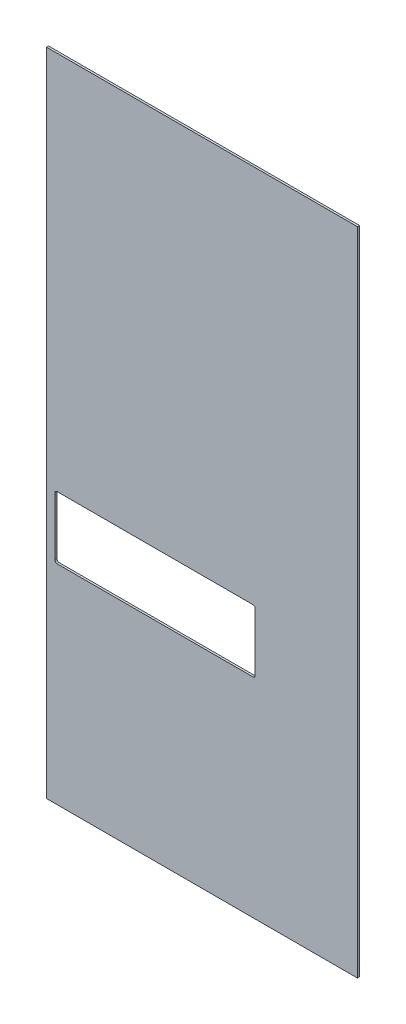
ISO-10303-21;
HEADER;
FILE_DESCRIPTION(('STEP AP214'),'2;1');
FILE_NAME('part.step','',(''),(''),'','','');
FILE_SCHEMA(('AUTOMOTIVE_DESIGN { 1 0 10303 214 1 1 1 1 }'));
ENDSEC;
DATA;
#1=APPLICATION_CONTEXT('core data for automotive mechanical design processes');
#2=APPLICATION_PROTOCOL_DEFINITION('international standard','automotive_design',2000,#1);
#3=PRODUCT_CONTEXT('',#1,'mechanical');
#4=PRODUCT('Part','Part','',(#3));
#5=PRODUCT_RELATED_PRODUCT_CATEGORY('part','',(#4));
#6=PRODUCT_DEFINITION_FORMATION('','',#4);
#7=PRODUCT_DEFINITION_CONTEXT('part definition',#1,'design');
#8=PRODUCT_DEFINITION('design','',#6,#7);
#9=PRODUCT_DEFINITION_SHAPE('','',#8);
#10=(LENGTH_UNIT() NAMED_UNIT(*) SI_UNIT(.MILLI.,.METRE.));
#11=(NAMED_UNIT(*) PLANE_ANGLE_UNIT() SI_UNIT($,.RADIAN.));
#12=(NAMED_UNIT(*) SI_UNIT($,.STERADIAN.) SOLID_ANGLE_UNIT());
#13=UNCERTAINTY_MEASURE_WITH_UNIT(LENGTH_MEASURE(1.E-05),#10,'distance_accuracy_value','');
#14=(GEOMETRIC_REPRESENTATION_CONTEXT(3) GLOBAL_UNCERTAINTY_ASSIGNED_CONTEXT((#13)) GLOBAL_UNIT_ASSIGNED_CONTEXT((#10,
#11,#12)) REPRESENTATION_CONTEXT('',''));
#15=CARTESIAN_POINT('',(0.,0.,0.));
#16=DIRECTION('',(0.,0.,1.));
#17=DIRECTION('',(1.,0.,0.));
#18=AXIS2_PLACEMENT_3D('',#15,#16,#17);
#19=CARTESIAN_POINT('',(0.,0.,0.));
#20=DIRECTION('',(0.,0.,1.));
#21=DIRECTION('',(1.,0.,0.));
#22=AXIS2_PLACEMENT_3D('',#19,#20,#21);
#23=PLANE('',#22);
#24=CARTESIAN_POINT('',(155.575,-349.25,0.));
#25=DIRECTION('',(0.,0.,-1.));
#26=DIRECTION('',(-1.,0.,0.));
#27=AXIS2_PLACEMENT_3D('',#24,#25,#26);
#28=CIRCLE('',#27,6.35);
#29=CARTESIAN_POINT('',(155.575,-355.6,0.));
#30=VERTEX_POINT('',#29);
#31=CARTESIAN_POINT('',(161.925,-349.25,0.));
#32=VERTEX_POINT('',#31);
#33=EDGE_CURVE('E176',#30,#32,#28,.F.);
#34=ORIENTED_EDGE('',*,*,#33,.T.);
#35=DIRECTION('',(0.,1.,0.));
#36=VECTOR('',#35,1.);
#37=CARTESIAN_POINT('',(161.925,-355.6,0.));
#38=LINE('',#37,#36);
#39=CARTESIAN_POINT('',(161.925,-171.45,0.));
#40=VERTEX_POINT('',#39);
#41=EDGE_CURVE('E154',#32,#40,#38,.T.);
#42=ORIENTED_EDGE('',*,*,#41,.T.);
#43=CARTESIAN_POINT('',(155.575,-171.45,0.));
#44=DIRECTION('',(0.,0.,-1.));
#45=DIRECTION('',(-1.,0.,0.));
#46=AXIS2_PLACEMENT_3D('',#43,#44,#45);
#47=CIRCLE('',#46,6.35);
#48=CARTESIAN_POINT('',(155.575,-165.1,0.));
#49=VERTEX_POINT('',#48);
#50=EDGE_CURVE('E177',#40,#49,#47,.F.);
#51=ORIENTED_EDGE('',*,*,#50,.T.);
#52=DIRECTION('',(1.,0.,0.));
#53=VECTOR('',#52,1.);
#54=CARTESIAN_POINT('',(161.925,-165.1,0.));
#55=LINE('',#54,#53);
#56=CARTESIAN_POINT('',(-441.325,-165.1,0.));
#57=VERTEX_POINT('',#56);
#58=EDGE_CURVE('E101',#49,#57,#55,.F.);
#59=ORIENTED_EDGE('',*,*,#58,.T.);
#60=CARTESIAN_POINT('',(-441.325,-171.45,0.));
#61=DIRECTION('',(0.,0.,-1.));
#62=DIRECTION('',(-1.,0.,0.));
#63=AXIS2_PLACEMENT_3D('',#60,#61,#62);
#64=CIRCLE('',#63,6.35);
#65=CARTESIAN_POINT('',(-447.675,-171.45,0.));
#66=VERTEX_POINT('',#65);
#67=EDGE_CURVE('E36',#57,#66,#64,.F.);
#68=ORIENTED_EDGE('',*,*,#67,.T.);
#69=DIRECTION('',(0.,1.,0.));
#70=VECTOR('',#69,1.);
#71=CARTESIAN_POINT('',(-447.675,-165.1,0.));
#72=LINE('',#71,#70);
#73=CARTESIAN_POINT('',(-447.675,-349.25,0.));
#74=VERTEX_POINT('',#73);
#75=EDGE_CURVE('E151',#66,#74,#72,.F.);
#76=ORIENTED_EDGE('',*,*,#75,.T.);
#77=CARTESIAN_POINT('',(-441.325,-349.25,0.));
#78=DIRECTION('',(0.,0.,-1.));
#79=DIRECTION('',(-1.,0.,0.));
#80=AXIS2_PLACEMENT_3D('',#77,#78,#79);
#81=CIRCLE('',#80,6.35);
#82=CARTESIAN_POINT('',(-441.325,-355.6,0.));
#83=VERTEX_POINT('',#82);
#84=EDGE_CURVE('E173',#74,#83,#81,.F.);
#85=ORIENTED_EDGE('',*,*,#84,.T.);
#86=DIRECTION('',(1.,0.,0.));
#87=VECTOR('',#86,1.);
#88=CARTESIAN_POINT('',(-447.675,-355.6,0.));
#89=LINE('',#88,#87);
#90=EDGE_CURVE('E147',#83,#30,#89,.T.);
#91=ORIENTED_EDGE('',*,*,#90,.T.);
#92=EDGE_LOOP('',(#34,#42,#51,#59,#68,#76,#85,#91));
#93=FACE_BOUND('',#92,.T.);
#94=DIRECTION('',(1.,0.,0.));
#95=VECTOR('',#94,1.);
#96=CARTESIAN_POINT('',(473.075,990.6,0.));
#97=LINE('',#96,#95);
#98=CARTESIAN_POINT('',(473.075,990.6,0.));
#99=VERTEX_POINT('',#98);
#100=CARTESIAN_POINT('',(-473.075,990.6,0.));
#101=VERTEX_POINT('',#100);
#102=EDGE_CURVE('E191',#99,#101,#97,.F.);
#103=ORIENTED_EDGE('',*,*,#102,.F.);
#104=DIRECTION('',(0.,1.,0.));
#105=VECTOR('',#104,1.);
#106=CARTESIAN_POINT('',(473.075,-990.6,0.));
#107=LINE('',#106,#105);
#108=CARTESIAN_POINT('',(473.075,-990.6,0.));
#109=VERTEX_POINT('',#108);
#110=EDGE_CURVE('E119',#109,#99,#107,.T.);
#111=ORIENTED_EDGE('',*,*,#110,.F.);
#112=DIRECTION('',(1.,0.,0.));
#113=VECTOR('',#112,1.);
#114=CARTESIAN_POINT('',(-473.075,-990.6,0.));
#115=LINE('',#114,#113);
#116=CARTESIAN_POINT('',(-473.075,-990.6,0.));
#117=VERTEX_POINT('',#116);
#118=EDGE_CURVE('E121',#117,#109,#115,.T.);
#119=ORIENTED_EDGE('',*,*,#118,.F.);
#120=DIRECTION('',(0.,1.,0.));
#121=VECTOR('',#120,1.);
#122=CARTESIAN_POINT('',(-473.075,990.6,0.));
#123=LINE('',#122,#121);
#124=EDGE_CURVE('E112',#101,#117,#123,.F.);
#125=ORIENTED_EDGE('',*,*,#124,.F.);
#126=EDGE_LOOP('',(#103,#111,#119,#125));
#127=FACE_BOUND('',#126,.T.);
#128=ADVANCED_FACE('F33',(#93,#127),#23,.F.);
#129=CARTESIAN_POINT('',(-473.075,990.6,0.));
#130=DIRECTION('',(-1.,0.,0.));
#131=DIRECTION('',(0.,0.,1.));
#132=AXIS2_PLACEMENT_3D('',#129,#130,#131);
#133=PLANE('',#132);
#134=DIRECTION('',(0.,1.,0.));
#135=VECTOR('',#134,1.);
#136=CARTESIAN_POINT('',(-473.075,0.,6.35));
#137=LINE('',#136,#135);
#138=CARTESIAN_POINT('',(-473.075,990.6,6.35));
#139=VERTEX_POINT('',#138);
#140=CARTESIAN_POINT('',(-473.075,-990.6,6.35));
#141=VERTEX_POINT('',#140);
#142=EDGE_CURVE('E202',#139,#141,#137,.F.);
#143=ORIENTED_EDGE('',*,*,#142,.F.);
#144=DIRECTION('',(0.,0.,1.));
#145=VECTOR('',#144,1.);
#146=CARTESIAN_POINT('',(-473.075,990.6,0.));
#147=LINE('',#146,#145);
#148=EDGE_CURVE('E135',#101,#139,#147,.T.);
#149=ORIENTED_EDGE('',*,*,#148,.F.);
#150=ORIENTED_EDGE('',*,*,#124,.T.);
#151=DIRECTION('',(0.,0.,-1.));
#152=VECTOR('',#151,1.);
#153=CARTESIAN_POINT('',(-473.075,-990.6,0.));
#154=LINE('',#153,#152);
#155=EDGE_CURVE('E126',#141,#117,#154,.T.);
#156=ORIENTED_EDGE('',*,*,#155,.F.);
#157=EDGE_LOOP('',(#143,#149,#150,#156));
#158=FACE_BOUND('',#157,.T.);
#159=ADVANCED_FACE('F131',(#158),#133,.T.);
#160=CARTESIAN_POINT('',(-473.075,-990.6,0.));
#161=DIRECTION('',(0.,-1.,0.));
#162=DIRECTION('',(0.,0.,-1.));
#163=AXIS2_PLACEMENT_3D('',#160,#161,#162);
#164=PLANE('',#163);
#165=DIRECTION('',(1.,0.,0.));
#166=VECTOR('',#165,1.);
#167=CARTESIAN_POINT('',(0.,-990.6,6.35));
#168=LINE('',#167,#166);
#169=CARTESIAN_POINT('',(473.075,-990.6,6.35));
#170=VERTEX_POINT('',#169);
#171=EDGE_CURVE('E140',#141,#170,#168,.T.);
#172=ORIENTED_EDGE('',*,*,#171,.F.);
#173=ORIENTED_EDGE('',*,*,#155,.T.);
#174=ORIENTED_EDGE('',*,*,#118,.T.);
#175=DIRECTION('',(0.,0.,-1.));
#176=VECTOR('',#175,1.);
#177=CARTESIAN_POINT('',(473.075,-990.6,0.));
#178=LINE('',#177,#176);
#179=EDGE_CURVE('E143',#170,#109,#178,.T.);
#180=ORIENTED_EDGE('',*,*,#179,.F.);
#181=EDGE_LOOP('',(#172,#173,#174,#180));
#182=FACE_BOUND('',#181,.T.);
#183=ADVANCED_FACE('F138',(#182),#164,.T.);
#184=CARTESIAN_POINT('',(473.075,-990.6,0.));
#185=DIRECTION('',(1.,0.,0.));
#186=DIRECTION('',(0.,0.,-1.));
#187=AXIS2_PLACEMENT_3D('',#184,#185,#186);
#188=PLANE('',#187);
#189=DIRECTION('',(0.,1.,0.));
#190=VECTOR('',#189,1.);
#191=CARTESIAN_POINT('',(473.075,0.,6.35));
#192=LINE('',#191,#190);
#193=CARTESIAN_POINT('',(473.075,990.6,6.35));
#194=VERTEX_POINT('',#193);
#195=EDGE_CURVE('E198',#170,#194,#192,.T.);
#196=ORIENTED_EDGE('',*,*,#195,.F.);
#197=ORIENTED_EDGE('',*,*,#179,.T.);
#198=ORIENTED_EDGE('',*,*,#110,.T.);
#199=DIRECTION('',(0.,0.,1.));
#200=VECTOR('',#199,1.);
#201=CARTESIAN_POINT('',(473.075,990.6,0.));
#202=LINE('',#201,#200);
#203=EDGE_CURVE('E153',#194,#99,#202,.F.);
#204=ORIENTED_EDGE('',*,*,#203,.F.);
#205=EDGE_LOOP('',(#196,#197,#198,#204));
#206=FACE_BOUND('',#205,.T.);
#207=ADVANCED_FACE('F194',(#206),#188,.T.);
#208=CARTESIAN_POINT('',(473.075,990.6,0.));
#209=DIRECTION('',(0.,1.,0.));
#210=DIRECTION('',(0.,0.,1.));
#211=AXIS2_PLACEMENT_3D('',#208,#209,#210);
#212=PLANE('',#211);
#213=DIRECTION('',(1.,0.,0.));
#214=VECTOR('',#213,1.);
#215=CARTESIAN_POINT('',(0.,990.6,6.35));
#216=LINE('',#215,#214);
#217=EDGE_CURVE('E209',#194,#139,#216,.F.);
#218=ORIENTED_EDGE('',*,*,#217,.F.);
#219=ORIENTED_EDGE('',*,*,#203,.T.);
#220=ORIENTED_EDGE('',*,*,#102,.T.);
#221=ORIENTED_EDGE('',*,*,#148,.T.);
#222=EDGE_LOOP('',(#218,#219,#220,#221));
#223=FACE_BOUND('',#222,.T.);
#224=ADVANCED_FACE('F208',(#223),#212,.T.);
#225=CARTESIAN_POINT('',(-447.675,-165.1,6.35));
#226=DIRECTION('',(-1.,0.,0.));
#227=DIRECTION('',(0.,0.,1.));
#228=AXIS2_PLACEMENT_3D('',#225,#226,#227);
#229=PLANE('',#228);
#230=DIRECTION('',(0.,1.,0.));
#231=VECTOR('',#230,1.);
#232=CARTESIAN_POINT('',(-447.675,0.,6.35));
#233=LINE('',#232,#231);
#234=CARTESIAN_POINT('',(-447.675,-349.25,6.35));
#235=VERTEX_POINT('',#234);
#236=CARTESIAN_POINT('',(-447.675,-171.45,6.35));
#237=VERTEX_POINT('',#236);
#238=EDGE_CURVE('E172',#235,#237,#233,.T.);
#239=ORIENTED_EDGE('',*,*,#238,.F.);
#240=DIRECTION('',(0.,0.,-1.));
#241=VECTOR('',#240,1.);
#242=CARTESIAN_POINT('',(-447.675,-349.25,14.62786));
#243=LINE('',#242,#241);
#244=EDGE_CURVE('E175',#235,#74,#243,.T.);
#245=ORIENTED_EDGE('',*,*,#244,.T.);
#246=ORIENTED_EDGE('',*,*,#75,.F.);
#247=DIRECTION('',(0.,0.,-1.));
#248=VECTOR('',#247,1.);
#249=CARTESIAN_POINT('',(-447.675,-171.45,14.62786));
#250=LINE('',#249,#248);
#251=EDGE_CURVE('E159',#66,#237,#250,.F.);
#252=ORIENTED_EDGE('',*,*,#251,.T.);
#253=EDGE_LOOP('',(#239,#245,#246,#252));
#254=FACE_BOUND('',#253,.T.);
#255=ADVANCED_FACE('F250',(#254),#229,.F.);
#256=CARTESIAN_POINT('',(-441.325,-171.45,14.62786));
#257=DIRECTION('',(0.,0.,-1.));
#258=DIRECTION('',(-1.,0.,0.));
#259=AXIS2_PLACEMENT_3D('',#256,#257,#258);
#260=CYLINDRICAL_SURFACE('',#259,6.35);
#261=ORIENTED_EDGE('',*,*,#67,.F.);
#262=DIRECTION('',(0.,0.,1.));
#263=VECTOR('',#262,1.);
#264=CARTESIAN_POINT('',(-441.325,-165.1,6.35));
#265=LINE('',#264,#263);
#266=CARTESIAN_POINT('',(-441.325,-165.1,6.35));
#267=VERTEX_POINT('',#266);
#268=EDGE_CURVE('E158',#57,#267,#265,.T.);
#269=ORIENTED_EDGE('',*,*,#268,.T.);
#270=CARTESIAN_POINT('',(-441.325,-171.45,6.35));
#271=DIRECTION('',(0.,0.,-1.));
#272=DIRECTION('',(-1.,0.,0.));
#273=AXIS2_PLACEMENT_3D('',#270,#271,#272);
#274=CIRCLE('',#273,6.35);
#275=EDGE_CURVE('E169',#237,#267,#274,.T.);
#276=ORIENTED_EDGE('',*,*,#275,.F.);
#277=ORIENTED_EDGE('',*,*,#251,.F.);
#278=EDGE_LOOP('',(#261,#269,#276,#277));
#279=FACE_BOUND('',#278,.T.);
#280=ADVANCED_FACE('F252',(#279),#260,.F.);
#281=CARTESIAN_POINT('',(161.925,-165.1,6.35));
#282=DIRECTION('',(0.,1.,0.));
#283=DIRECTION('',(0.,0.,1.));
#284=AXIS2_PLACEMENT_3D('',#281,#282,#283);
#285=PLANE('',#284);
#286=ORIENTED_EDGE('',*,*,#58,.F.);
#287=DIRECTION('',(0.,0.,-1.));
#288=VECTOR('',#287,1.);
#289=CARTESIAN_POINT('',(155.575,-165.1,14.62786));
#290=LINE('',#289,#288);
#291=CARTESIAN_POINT('',(155.575,-165.1,6.35));
#292=VERTEX_POINT('',#291);
#293=EDGE_CURVE('E157',#49,#292,#290,.F.);
#294=ORIENTED_EDGE('',*,*,#293,.T.);
#295=DIRECTION('',(1.,0.,0.));
#296=VECTOR('',#295,1.);
#297=CARTESIAN_POINT('',(0.,-165.1,6.35));
#298=LINE('',#297,#296);
#299=EDGE_CURVE('E168',#267,#292,#298,.T.);
#300=ORIENTED_EDGE('',*,*,#299,.F.);
#301=ORIENTED_EDGE('',*,*,#268,.F.);
#302=EDGE_LOOP('',(#286,#294,#300,#301));
#303=FACE_BOUND('',#302,.T.);
#304=ADVANCED_FACE('F254',(#303),#285,.F.);
#305=CARTESIAN_POINT('',(155.575,-171.45,14.62786));
#306=DIRECTION('',(0.,0.,-1.));
#307=DIRECTION('',(-1.,0.,0.));
#308=AXIS2_PLACEMENT_3D('',#305,#306,#307);
#309=CYLINDRICAL_SURFACE('',#308,6.35);
#310=ORIENTED_EDGE('',*,*,#50,.F.);
#311=DIRECTION('',(0.,0.,-1.));
#312=VECTOR('',#311,1.);
#313=CARTESIAN_POINT('',(161.925,-171.45,6.35));
#314=LINE('',#313,#312);
#315=CARTESIAN_POINT('',(161.925,-171.45,6.35));
#316=VERTEX_POINT('',#315);
#317=EDGE_CURVE('E156',#40,#316,#314,.F.);
#318=ORIENTED_EDGE('',*,*,#317,.T.);
#319=CARTESIAN_POINT('',(155.575,-171.45,6.35));
#320=DIRECTION('',(0.,0.,-1.));
#321=DIRECTION('',(-1.,0.,0.));
#322=AXIS2_PLACEMENT_3D('',#319,#320,#321);
#323=CIRCLE('',#322,6.35);
#324=EDGE_CURVE('E165',#292,#316,#323,.T.);
#325=ORIENTED_EDGE('',*,*,#324,.F.);
#326=ORIENTED_EDGE('',*,*,#293,.F.);
#327=EDGE_LOOP('',(#310,#318,#325,#326));
#328=FACE_BOUND('',#327,.T.);
#329=ADVANCED_FACE('F226',(#328),#309,.F.);
#330=CARTESIAN_POINT('',(161.925,-355.6,6.35));
#331=DIRECTION('',(1.,0.,0.));
#332=DIRECTION('',(0.,0.,-1.));
#333=AXIS2_PLACEMENT_3D('',#330,#331,#332);
#334=PLANE('',#333);
#335=DIRECTION('',(0.,1.,0.));
#336=VECTOR('',#335,1.);
#337=CARTESIAN_POINT('',(161.925,0.,6.35));
#338=LINE('',#337,#336);
#339=CARTESIAN_POINT('',(161.925,-349.25,6.35));
#340=VERTEX_POINT('',#339);
#341=EDGE_CURVE('E164',#316,#340,#338,.F.);
#342=ORIENTED_EDGE('',*,*,#341,.F.);
#343=ORIENTED_EDGE('',*,*,#317,.F.);
#344=ORIENTED_EDGE('',*,*,#41,.F.);
#345=DIRECTION('',(0.,0.,-1.));
#346=VECTOR('',#345,1.);
#347=CARTESIAN_POINT('',(161.925,-349.25,14.62786));
#348=LINE('',#347,#346);
#349=EDGE_CURVE('E150',#32,#340,#348,.F.);
#350=ORIENTED_EDGE('',*,*,#349,.T.);
#351=EDGE_LOOP('',(#342,#343,#344,#350));
#352=FACE_BOUND('',#351,.T.);
#353=ADVANCED_FACE('F232',(#352),#334,.F.);
#354=CARTESIAN_POINT('',(155.575,-349.25,14.62786));
#355=DIRECTION('',(0.,0.,-1.));
#356=DIRECTION('',(-1.,0.,0.));
#357=AXIS2_PLACEMENT_3D('',#354,#355,#356);
#358=CYLINDRICAL_SURFACE('',#357,6.35);
#359=ORIENTED_EDGE('',*,*,#33,.F.);
#360=DIRECTION('',(0.,0.,-1.));
#361=VECTOR('',#360,1.);
#362=CARTESIAN_POINT('',(155.575,-355.6,6.35));
#363=LINE('',#362,#361);
#364=CARTESIAN_POINT('',(155.575,-355.6,6.35));
#365=VERTEX_POINT('',#364);
#366=EDGE_CURVE('E149',#30,#365,#363,.F.);
#367=ORIENTED_EDGE('',*,*,#366,.T.);
#368=CARTESIAN_POINT('',(155.575,-349.25,6.35));
#369=DIRECTION('',(0.,0.,-1.));
#370=DIRECTION('',(-1.,0.,0.));
#371=AXIS2_PLACEMENT_3D('',#368,#369,#370);
#372=CIRCLE('',#371,6.35);
#373=EDGE_CURVE('E161',#340,#365,#372,.T.);
#374=ORIENTED_EDGE('',*,*,#373,.F.);
#375=ORIENTED_EDGE('',*,*,#349,.F.);
#376=EDGE_LOOP('',(#359,#367,#374,#375));
#377=FACE_BOUND('',#376,.T.);
#378=ADVANCED_FACE('F244',(#377),#358,.F.);
#379=CARTESIAN_POINT('',(-447.675,-355.6,6.35));
#380=DIRECTION('',(0.,-1.,0.));
#381=DIRECTION('',(0.,0.,-1.));
#382=AXIS2_PLACEMENT_3D('',#379,#380,#381);
#383=PLANE('',#382);
#384=DIRECTION('',(1.,0.,0.));
#385=VECTOR('',#384,1.);
#386=CARTESIAN_POINT('',(0.,-355.6,6.35));
#387=LINE('',#386,#385);
#388=CARTESIAN_POINT('',(-441.325,-355.6,6.35));
#389=VERTEX_POINT('',#388);
#390=EDGE_CURVE('E42',#365,#389,#387,.F.);
#391=ORIENTED_EDGE('',*,*,#390,.F.);
#392=ORIENTED_EDGE('',*,*,#366,.F.);
#393=ORIENTED_EDGE('',*,*,#90,.F.);
#394=DIRECTION('',(0.,0.,-1.));
#395=VECTOR('',#394,1.);
#396=CARTESIAN_POINT('',(-441.325,-355.6,14.62786));
#397=LINE('',#396,#395);
#398=EDGE_CURVE('E51',#83,#389,#397,.F.);
#399=ORIENTED_EDGE('',*,*,#398,.T.);
#400=EDGE_LOOP('',(#391,#392,#393,#399));
#401=FACE_BOUND('',#400,.T.);
#402=ADVANCED_FACE('F241',(#401),#383,.F.);
#403=CARTESIAN_POINT('',(-441.325,-349.25,14.62786));
#404=DIRECTION('',(0.,0.,-1.));
#405=DIRECTION('',(-1.,0.,0.));
#406=AXIS2_PLACEMENT_3D('',#403,#404,#405);
#407=CYLINDRICAL_SURFACE('',#406,6.35);
#408=ORIENTED_EDGE('',*,*,#84,.F.);
#409=ORIENTED_EDGE('',*,*,#244,.F.);
#410=CARTESIAN_POINT('',(-441.325,-349.25,6.35));
#411=DIRECTION('',(0.,0.,-1.));
#412=DIRECTION('',(-1.,0.,0.));
#413=AXIS2_PLACEMENT_3D('',#410,#411,#412);
#414=CIRCLE('',#413,6.35);
#415=EDGE_CURVE('E11',#389,#235,#414,.T.);
#416=ORIENTED_EDGE('',*,*,#415,.F.);
#417=ORIENTED_EDGE('',*,*,#398,.F.);
#418=EDGE_LOOP('',(#408,#409,#416,#417));
#419=FACE_BOUND('',#418,.T.);
#420=ADVANCED_FACE('F248',(#419),#407,.F.);
#421=CARTESIAN_POINT('',(0.,0.,6.35));
#422=DIRECTION('',(0.,0.,1.));
#423=DIRECTION('',(1.,0.,0.));
#424=AXIS2_PLACEMENT_3D('',#421,#422,#423);
#425=PLANE('',#424);
#426=ORIENTED_EDGE('',*,*,#390,.T.);
#427=ORIENTED_EDGE('',*,*,#415,.T.);
#428=ORIENTED_EDGE('',*,*,#238,.T.);
#429=ORIENTED_EDGE('',*,*,#275,.T.);
#430=ORIENTED_EDGE('',*,*,#299,.T.);
#431=ORIENTED_EDGE('',*,*,#324,.T.);
#432=ORIENTED_EDGE('',*,*,#341,.T.);
#433=ORIENTED_EDGE('',*,*,#373,.T.);
#434=EDGE_LOOP('',(#426,#427,#428,#429,#430,#431,#432,#433));
#435=FACE_BOUND('',#434,.T.);
#436=ORIENTED_EDGE('',*,*,#195,.T.);
#437=ORIENTED_EDGE('',*,*,#217,.T.);
#438=ORIENTED_EDGE('',*,*,#142,.T.);
#439=ORIENTED_EDGE('',*,*,#171,.T.);
#440=EDGE_LOOP('',(#436,#437,#438,#439));
#441=FACE_BOUND('',#440,.T.);
#442=ADVANCED_FACE('F210',(#435,#441),#425,.T.);
#443=CLOSED_SHELL('',(#128,#159,#183,#207,#224,#255,#280,#304,#329,#353,#378,#402,#420,#442));
#444=MANIFOLD_SOLID_BREP('B2',#443);
#445=ADVANCED_BREP_SHAPE_REPRESENTATION('',(#18,#444),#14);
#446=SHAPE_DEFINITION_REPRESENTATION(#9,#445);
ENDSEC;
END-ISO-10303-21;
